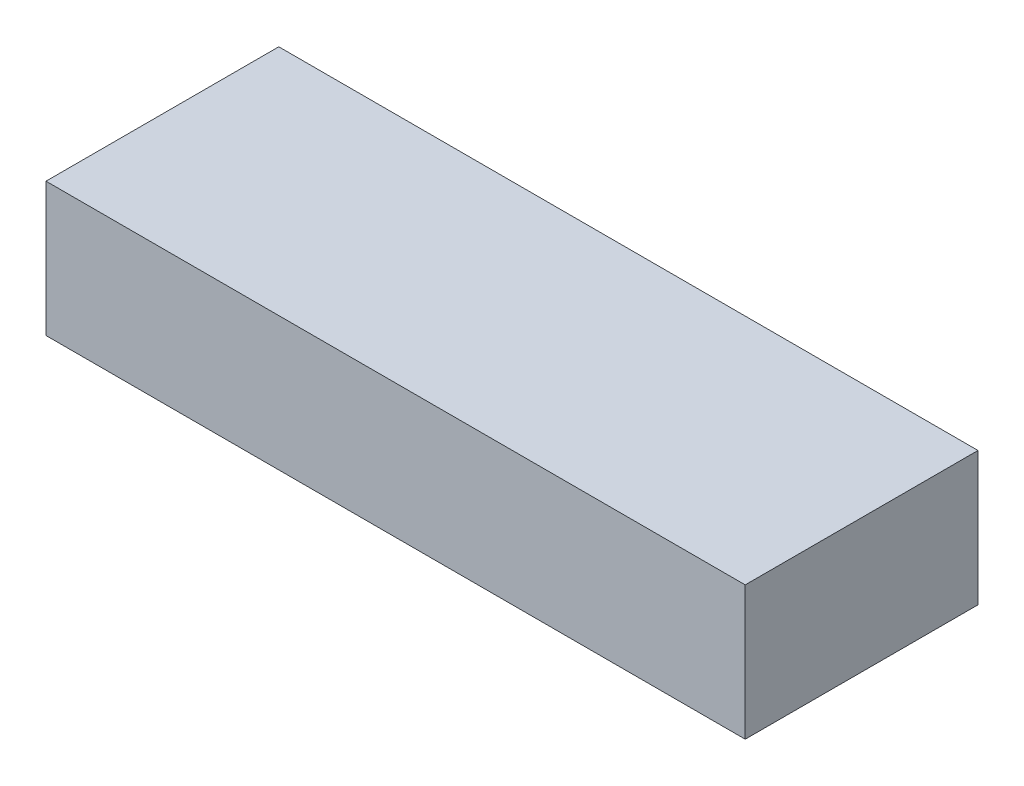
ISO-10303-21;
HEADER;
FILE_DESCRIPTION(('STEP AP214'),'2;1');
FILE_NAME('part.step','',(''),(''),'','','');
FILE_SCHEMA(('AUTOMOTIVE_DESIGN { 1 0 10303 214 1 1 1 1 }'));
ENDSEC;
DATA;
#1=APPLICATION_CONTEXT('core data for automotive mechanical design processes');
#2=APPLICATION_PROTOCOL_DEFINITION('international standard','automotive_design',2000,#1);
#3=PRODUCT_CONTEXT('',#1,'mechanical');
#4=PRODUCT('Part','Part','',(#3));
#5=PRODUCT_RELATED_PRODUCT_CATEGORY('part','',(#4));
#6=PRODUCT_DEFINITION_FORMATION('','',#4);
#7=PRODUCT_DEFINITION_CONTEXT('part definition',#1,'design');
#8=PRODUCT_DEFINITION('design','',#6,#7);
#9=PRODUCT_DEFINITION_SHAPE('','',#8);
#10=(LENGTH_UNIT() NAMED_UNIT(*) SI_UNIT(.MILLI.,.METRE.));
#11=(NAMED_UNIT(*) PLANE_ANGLE_UNIT() SI_UNIT($,.RADIAN.));
#12=(NAMED_UNIT(*) SI_UNIT($,.STERADIAN.) SOLID_ANGLE_UNIT());
#13=UNCERTAINTY_MEASURE_WITH_UNIT(LENGTH_MEASURE(1.E-05),#10,'distance_accuracy_value','');
#14=(GEOMETRIC_REPRESENTATION_CONTEXT(3) GLOBAL_UNCERTAINTY_ASSIGNED_CONTEXT((#13)) GLOBAL_UNIT_ASSIGNED_CONTEXT((#10,
#11,#12)) REPRESENTATION_CONTEXT('',''));
#15=CARTESIAN_POINT('',(0.,0.,0.));
#16=DIRECTION('',(0.,0.,1.));
#17=DIRECTION('',(1.,0.,0.));
#18=AXIS2_PLACEMENT_3D('',#15,#16,#17);
#19=CARTESIAN_POINT('',(-7.5841853088481,2.93225,5.52));
#20=DIRECTION('',(1.,0.,0.));
#21=DIRECTION('',(0.,0.,-1.));
#22=AXIS2_PLACEMENT_3D('',#19,#20,#21);
#23=PLANE('',#22);
#24=DIRECTION('',(0.,-1.,0.));
#25=VECTOR('',#24,1.);
#26=CARTESIAN_POINT('',(-7.5841853088481,2.93225,0.));
#27=LINE('',#26,#25);
#28=CARTESIAN_POINT('',(-7.5841853088481,6.10225,0.));
#29=VERTEX_POINT('',#28);
#30=CARTESIAN_POINT('',(-7.5841853088481,2.93225,0.));
#31=VERTEX_POINT('',#30);
#32=EDGE_CURVE('E95',#29,#31,#27,.T.);
#33=ORIENTED_EDGE('',*,*,#32,.T.);
#34=DIRECTION('',(0.,0.,-1.));
#35=VECTOR('',#34,1.);
#36=CARTESIAN_POINT('',(-7.5841853088481,2.93225,5.52));
#37=LINE('',#36,#35);
#38=CARTESIAN_POINT('',(-7.5841853088481,2.93225,5.52));
#39=VERTEX_POINT('',#38);
#40=EDGE_CURVE('E11',#39,#31,#37,.T.);
#41=ORIENTED_EDGE('',*,*,#40,.F.);
#42=DIRECTION('',(0.,-1.,0.));
#43=VECTOR('',#42,1.);
#44=CARTESIAN_POINT('',(-7.5841853088481,2.93225,5.52));
#45=LINE('',#44,#43);
#46=CARTESIAN_POINT('',(-7.5841853088481,6.10225,5.52));
#47=VERTEX_POINT('',#46);
#48=EDGE_CURVE('E83',#47,#39,#45,.T.);
#49=ORIENTED_EDGE('',*,*,#48,.F.);
#50=DIRECTION('',(0.,0.,-1.));
#51=VECTOR('',#50,1.);
#52=CARTESIAN_POINT('',(-7.5841853088481,6.10225,5.52));
#53=LINE('',#52,#51);
#54=EDGE_CURVE('E91',#47,#29,#53,.T.);
#55=ORIENTED_EDGE('',*,*,#54,.T.);
#56=EDGE_LOOP('',(#33,#41,#49,#55));
#57=FACE_BOUND('',#56,.T.);
#58=ADVANCED_FACE('F32',(#57),#23,.F.);
#59=CARTESIAN_POINT('',(-7.5841853088481,2.93225,5.52));
#60=DIRECTION('',(0.,1.,0.));
#61=DIRECTION('',(-1.,0.,0.));
#62=AXIS2_PLACEMENT_3D('',#59,#60,#61);
#63=PLANE('',#62);
#64=DIRECTION('',(1.,0.,0.));
#65=VECTOR('',#64,1.);
#66=CARTESIAN_POINT('',(-7.5841853088481,2.93225,0.));
#67=LINE('',#66,#65);
#68=CARTESIAN_POINT('',(8.9958146911519,2.93225,0.));
#69=VERTEX_POINT('',#68);
#70=EDGE_CURVE('E87',#31,#69,#67,.T.);
#71=ORIENTED_EDGE('',*,*,#70,.T.);
#72=DIRECTION('',(0.,0.,-1.));
#73=VECTOR('',#72,1.);
#74=CARTESIAN_POINT('',(8.9958146911519,2.93225,5.52));
#75=LINE('',#74,#73);
#76=CARTESIAN_POINT('',(8.9958146911519,2.93225,5.52));
#77=VERTEX_POINT('',#76);
#78=EDGE_CURVE('E40',#77,#69,#75,.T.);
#79=ORIENTED_EDGE('',*,*,#78,.F.);
#80=DIRECTION('',(1.,0.,0.));
#81=VECTOR('',#80,1.);
#82=CARTESIAN_POINT('',(-7.5841853088481,2.93225,5.52));
#83=LINE('',#82,#81);
#84=EDGE_CURVE('E78',#39,#77,#83,.T.);
#85=ORIENTED_EDGE('',*,*,#84,.F.);
#86=ORIENTED_EDGE('',*,*,#40,.T.);
#87=EDGE_LOOP('',(#71,#79,#85,#86));
#88=FACE_BOUND('',#87,.T.);
#89=ADVANCED_FACE('F86',(#88),#63,.F.);
#90=CARTESIAN_POINT('',(8.9958146911519,2.93225,5.52));
#91=DIRECTION('',(-1.,0.,0.));
#92=DIRECTION('',(0.,0.,1.));
#93=AXIS2_PLACEMENT_3D('',#90,#91,#92);
#94=PLANE('',#93);
#95=DIRECTION('',(0.,1.,0.));
#96=VECTOR('',#95,1.);
#97=CARTESIAN_POINT('',(8.9958146911519,2.93225,0.));
#98=LINE('',#97,#96);
#99=CARTESIAN_POINT('',(8.9958146911519,6.10225,0.));
#100=VERTEX_POINT('',#99);
#101=EDGE_CURVE('E65',#69,#100,#98,.T.);
#102=ORIENTED_EDGE('',*,*,#101,.T.);
#103=DIRECTION('',(0.,0.,-1.));
#104=VECTOR('',#103,1.);
#105=CARTESIAN_POINT('',(8.9958146911519,6.10225,5.52));
#106=LINE('',#105,#104);
#107=CARTESIAN_POINT('',(8.9958146911519,6.10225,5.52));
#108=VERTEX_POINT('',#107);
#109=EDGE_CURVE('E88',#108,#100,#106,.T.);
#110=ORIENTED_EDGE('',*,*,#109,.F.);
#111=DIRECTION('',(0.,1.,0.));
#112=VECTOR('',#111,1.);
#113=CARTESIAN_POINT('',(8.9958146911519,2.93225,5.52));
#114=LINE('',#113,#112);
#115=EDGE_CURVE('E81',#77,#108,#114,.T.);
#116=ORIENTED_EDGE('',*,*,#115,.F.);
#117=ORIENTED_EDGE('',*,*,#78,.T.);
#118=EDGE_LOOP('',(#102,#110,#116,#117));
#119=FACE_BOUND('',#118,.T.);
#120=ADVANCED_FACE('F89',(#119),#94,.F.);
#121=CARTESIAN_POINT('',(-7.5841853088481,6.10225,5.52));
#122=DIRECTION('',(0.,-1.,0.));
#123=DIRECTION('',(0.,0.,-1.));
#124=AXIS2_PLACEMENT_3D('',#121,#122,#123);
#125=PLANE('',#124);
#126=DIRECTION('',(-1.,0.,0.));
#127=VECTOR('',#126,1.);
#128=CARTESIAN_POINT('',(-7.5841853088481,6.10225,0.));
#129=LINE('',#128,#127);
#130=EDGE_CURVE('E71',#100,#29,#129,.T.);
#131=ORIENTED_EDGE('',*,*,#130,.T.);
#132=ORIENTED_EDGE('',*,*,#54,.F.);
#133=DIRECTION('',(-1.,0.,0.));
#134=VECTOR('',#133,1.);
#135=CARTESIAN_POINT('',(-7.5841853088481,6.10225,5.52));
#136=LINE('',#135,#134);
#137=EDGE_CURVE('E48',#108,#47,#136,.T.);
#138=ORIENTED_EDGE('',*,*,#137,.F.);
#139=ORIENTED_EDGE('',*,*,#109,.T.);
#140=EDGE_LOOP('',(#131,#132,#138,#139));
#141=FACE_BOUND('',#140,.T.);
#142=ADVANCED_FACE('F102',(#141),#125,.F.);
#143=CARTESIAN_POINT('',(0.,0.,5.52));
#144=DIRECTION('',(0.,0.,-1.));
#145=DIRECTION('',(-1.,0.,0.));
#146=AXIS2_PLACEMENT_3D('',#143,#144,#145);
#147=PLANE('',#146);
#148=ORIENTED_EDGE('',*,*,#48,.T.);
#149=ORIENTED_EDGE('',*,*,#84,.T.);
#150=ORIENTED_EDGE('',*,*,#115,.T.);
#151=ORIENTED_EDGE('',*,*,#137,.T.);
#152=EDGE_LOOP('',(#148,#149,#150,#151));
#153=FACE_BOUND('',#152,.T.);
#154=ADVANCED_FACE('F79',(#153),#147,.F.);
#155=CARTESIAN_POINT('',(0.,0.,0.));
#156=DIRECTION('',(0.,0.,-1.));
#157=DIRECTION('',(-1.,0.,0.));
#158=AXIS2_PLACEMENT_3D('',#155,#156,#157);
#159=PLANE('',#158);
#160=ORIENTED_EDGE('',*,*,#32,.F.);
#161=ORIENTED_EDGE('',*,*,#130,.F.);
#162=ORIENTED_EDGE('',*,*,#101,.F.);
#163=ORIENTED_EDGE('',*,*,#70,.F.);
#164=EDGE_LOOP('',(#160,#161,#162,#163));
#165=FACE_BOUND('',#164,.T.);
#166=ADVANCED_FACE('F105',(#165),#159,.T.);
#167=CLOSED_SHELL('',(#58,#89,#120,#142,#154,#166));
#168=MANIFOLD_SOLID_BREP('B2',#167);
#169=ADVANCED_BREP_SHAPE_REPRESENTATION('',(#18,#168),#14);
#170=SHAPE_DEFINITION_REPRESENTATION(#9,#169);
ENDSEC;
END-ISO-10303-21;
